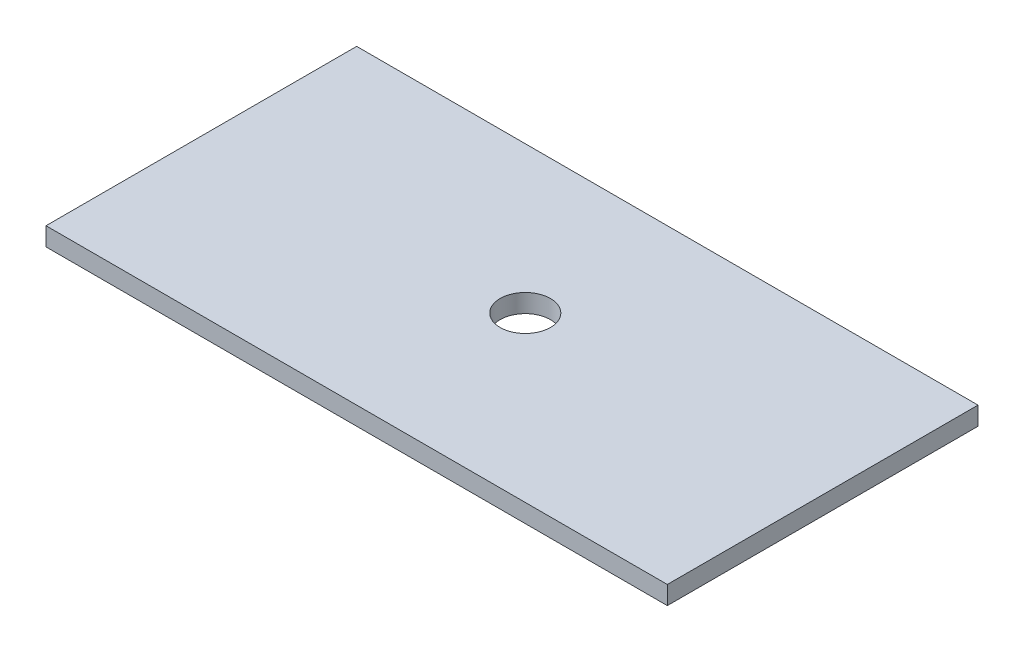
ISO-10303-21;
HEADER;
FILE_DESCRIPTION(('STEP AP214'),'2;1');
FILE_NAME('part.step','',(''),(''),'','','');
FILE_SCHEMA(('AUTOMOTIVE_DESIGN { 1 0 10303 214 1 1 1 1 }'));
ENDSEC;
DATA;
#1=APPLICATION_CONTEXT('core data for automotive mechanical design processes');
#2=APPLICATION_PROTOCOL_DEFINITION('international standard','automotive_design',2000,#1);
#3=PRODUCT_CONTEXT('',#1,'mechanical');
#4=PRODUCT('Part','Part','',(#3));
#5=PRODUCT_RELATED_PRODUCT_CATEGORY('part','',(#4));
#6=PRODUCT_DEFINITION_FORMATION('','',#4);
#7=PRODUCT_DEFINITION_CONTEXT('part definition',#1,'design');
#8=PRODUCT_DEFINITION('design','',#6,#7);
#9=PRODUCT_DEFINITION_SHAPE('','',#8);
#10=(LENGTH_UNIT() NAMED_UNIT(*) SI_UNIT(.MILLI.,.METRE.));
#11=(NAMED_UNIT(*) PLANE_ANGLE_UNIT() SI_UNIT($,.RADIAN.));
#12=(NAMED_UNIT(*) SI_UNIT($,.STERADIAN.) SOLID_ANGLE_UNIT());
#13=UNCERTAINTY_MEASURE_WITH_UNIT(LENGTH_MEASURE(1.E-05),#10,'distance_accuracy_value','');
#14=(GEOMETRIC_REPRESENTATION_CONTEXT(3) GLOBAL_UNCERTAINTY_ASSIGNED_CONTEXT((#13)) GLOBAL_UNIT_ASSIGNED_CONTEXT((#10,
#11,#12)) REPRESENTATION_CONTEXT('',''));
#15=CARTESIAN_POINT('',(0.,0.,0.));
#16=DIRECTION('',(0.,0.,1.));
#17=DIRECTION('',(1.,0.,0.));
#18=AXIS2_PLACEMENT_3D('',#15,#16,#17);
#19=CARTESIAN_POINT('',(0.,15.,0.));
#20=DIRECTION('',(0.,1.,0.));
#21=DIRECTION('',(0.,0.,1.));
#22=AXIS2_PLACEMENT_3D('',#19,#20,#21);
#23=PLANE('',#22);
#24=DIRECTION('',(0.,0.,1.));
#25=VECTOR('',#24,1.);
#26=CARTESIAN_POINT('',(0.,15.,0.));
#27=LINE('',#26,#25);
#28=CARTESIAN_POINT('',(0.,15.,0.));
#29=VERTEX_POINT('',#28);
#30=CARTESIAN_POINT('',(0.,15.,254.));
#31=VERTEX_POINT('',#30);
#32=EDGE_CURVE('E85',#29,#31,#27,.T.);
#33=ORIENTED_EDGE('',*,*,#32,.T.);
#34=DIRECTION('',(1.,0.,0.));
#35=VECTOR('',#34,1.);
#36=CARTESIAN_POINT('',(0.,15.,254.));
#37=LINE('',#36,#35);
#38=CARTESIAN_POINT('',(508.,15.,254.));
#39=VERTEX_POINT('',#38);
#40=EDGE_CURVE('E80',#31,#39,#37,.T.);
#41=ORIENTED_EDGE('',*,*,#40,.T.);
#42=DIRECTION('',(0.,0.,-1.));
#43=VECTOR('',#42,1.);
#44=CARTESIAN_POINT('',(508.,15.,0.));
#45=LINE('',#44,#43);
#46=CARTESIAN_POINT('',(508.,15.,0.));
#47=VERTEX_POINT('',#46);
#48=EDGE_CURVE('E83',#39,#47,#45,.T.);
#49=ORIENTED_EDGE('',*,*,#48,.T.);
#50=DIRECTION('',(-1.,0.,0.));
#51=VECTOR('',#50,1.);
#52=CARTESIAN_POINT('',(0.,15.,0.));
#53=LINE('',#52,#51);
#54=EDGE_CURVE('E50',#47,#29,#53,.T.);
#55=ORIENTED_EDGE('',*,*,#54,.T.);
#56=EDGE_LOOP('',(#33,#41,#49,#55));
#57=FACE_BOUND('',#56,.T.);
#58=CARTESIAN_POINT('',(257.707741617895,15.,119.849355451203));
#59=DIRECTION('',(0.,1.,0.));
#60=DIRECTION('',(0.,0.,1.));
#61=AXIS2_PLACEMENT_3D('',#58,#59,#60);
#62=CIRCLE('',#61,20.5570102159983);
#63=CARTESIAN_POINT('',(257.707741617895,15.,140.406365667201));
#64=VERTEX_POINT('',#63);
#65=EDGE_CURVE('E100',#64,#64,#62,.T.);
#66=ORIENTED_EDGE('',*,*,#65,.F.);
#67=EDGE_LOOP('',(#66));
#68=FACE_BOUND('',#67,.T.);
#69=ADVANCED_FACE('F33',(#57,#68),#23,.T.);
#70=CARTESIAN_POINT('',(0.,0.,0.));
#71=DIRECTION('',(0.,1.,0.));
#72=DIRECTION('',(0.,0.,1.));
#73=AXIS2_PLACEMENT_3D('',#70,#71,#72);
#74=PLANE('',#73);
#75=DIRECTION('',(0.,0.,1.));
#76=VECTOR('',#75,1.);
#77=CARTESIAN_POINT('',(0.,0.,0.));
#78=LINE('',#77,#76);
#79=CARTESIAN_POINT('',(0.,0.,0.));
#80=VERTEX_POINT('',#79);
#81=CARTESIAN_POINT('',(0.,0.,254.));
#82=VERTEX_POINT('',#81);
#83=EDGE_CURVE('E97',#80,#82,#78,.T.);
#84=ORIENTED_EDGE('',*,*,#83,.F.);
#85=DIRECTION('',(-1.,0.,0.));
#86=VECTOR('',#85,1.);
#87=CARTESIAN_POINT('',(0.,0.,0.));
#88=LINE('',#87,#86);
#89=CARTESIAN_POINT('',(508.,0.,0.));
#90=VERTEX_POINT('',#89);
#91=EDGE_CURVE('E73',#90,#80,#88,.T.);
#92=ORIENTED_EDGE('',*,*,#91,.F.);
#93=DIRECTION('',(0.,0.,-1.));
#94=VECTOR('',#93,1.);
#95=CARTESIAN_POINT('',(508.,0.,0.));
#96=LINE('',#95,#94);
#97=CARTESIAN_POINT('',(508.,0.,254.));
#98=VERTEX_POINT('',#97);
#99=EDGE_CURVE('E67',#98,#90,#96,.T.);
#100=ORIENTED_EDGE('',*,*,#99,.F.);
#101=DIRECTION('',(1.,0.,0.));
#102=VECTOR('',#101,1.);
#103=CARTESIAN_POINT('',(0.,0.,254.));
#104=LINE('',#103,#102);
#105=EDGE_CURVE('E89',#82,#98,#104,.T.);
#106=ORIENTED_EDGE('',*,*,#105,.F.);
#107=EDGE_LOOP('',(#84,#92,#100,#106));
#108=FACE_BOUND('',#107,.T.);
#109=CARTESIAN_POINT('',(257.707741617895,0.,119.849355451203));
#110=DIRECTION('',(0.,1.,0.));
#111=DIRECTION('',(0.,0.,1.));
#112=AXIS2_PLACEMENT_3D('',#109,#110,#111);
#113=CIRCLE('',#112,20.5570102159983);
#114=CARTESIAN_POINT('',(257.707741617895,0.,140.406365667201));
#115=VERTEX_POINT('',#114);
#116=EDGE_CURVE('E112',#115,#115,#113,.T.);
#117=ORIENTED_EDGE('',*,*,#116,.T.);
#118=EDGE_LOOP('',(#117));
#119=FACE_BOUND('',#118,.T.);
#120=ADVANCED_FACE('F108',(#108,#119),#74,.F.);
#121=CARTESIAN_POINT('',(0.,15.,0.));
#122=DIRECTION('',(1.,0.,0.));
#123=DIRECTION('',(0.,0.,-1.));
#124=AXIS2_PLACEMENT_3D('',#121,#122,#123);
#125=PLANE('',#124);
#126=ORIENTED_EDGE('',*,*,#83,.T.);
#127=DIRECTION('',(0.,-1.,0.));
#128=VECTOR('',#127,1.);
#129=CARTESIAN_POINT('',(0.,15.,254.));
#130=LINE('',#129,#128);
#131=EDGE_CURVE('E11',#31,#82,#130,.T.);
#132=ORIENTED_EDGE('',*,*,#131,.F.);
#133=ORIENTED_EDGE('',*,*,#32,.F.);
#134=DIRECTION('',(0.,-1.,0.));
#135=VECTOR('',#134,1.);
#136=CARTESIAN_POINT('',(0.,15.,0.));
#137=LINE('',#136,#135);
#138=EDGE_CURVE('E93',#29,#80,#137,.T.);
#139=ORIENTED_EDGE('',*,*,#138,.T.);
#140=EDGE_LOOP('',(#126,#132,#133,#139));
#141=FACE_BOUND('',#140,.T.);
#142=ADVANCED_FACE('F35',(#141),#125,.F.);
#143=CARTESIAN_POINT('',(0.,15.,254.));
#144=DIRECTION('',(0.,0.,-1.));
#145=DIRECTION('',(-1.,0.,0.));
#146=AXIS2_PLACEMENT_3D('',#143,#144,#145);
#147=PLANE('',#146);
#148=ORIENTED_EDGE('',*,*,#105,.T.);
#149=DIRECTION('',(0.,-1.,0.));
#150=VECTOR('',#149,1.);
#151=CARTESIAN_POINT('',(508.,15.,254.));
#152=LINE('',#151,#150);
#153=EDGE_CURVE('E42',#39,#98,#152,.T.);
#154=ORIENTED_EDGE('',*,*,#153,.F.);
#155=ORIENTED_EDGE('',*,*,#40,.F.);
#156=ORIENTED_EDGE('',*,*,#131,.T.);
#157=EDGE_LOOP('',(#148,#154,#155,#156));
#158=FACE_BOUND('',#157,.T.);
#159=ADVANCED_FACE('F88',(#158),#147,.F.);
#160=CARTESIAN_POINT('',(508.,15.,0.));
#161=DIRECTION('',(-1.,0.,0.));
#162=DIRECTION('',(0.,0.,1.));
#163=AXIS2_PLACEMENT_3D('',#160,#161,#162);
#164=PLANE('',#163);
#165=ORIENTED_EDGE('',*,*,#99,.T.);
#166=DIRECTION('',(0.,-1.,0.));
#167=VECTOR('',#166,1.);
#168=CARTESIAN_POINT('',(508.,15.,0.));
#169=LINE('',#168,#167);
#170=EDGE_CURVE('E90',#47,#90,#169,.T.);
#171=ORIENTED_EDGE('',*,*,#170,.F.);
#172=ORIENTED_EDGE('',*,*,#48,.F.);
#173=ORIENTED_EDGE('',*,*,#153,.T.);
#174=EDGE_LOOP('',(#165,#171,#172,#173));
#175=FACE_BOUND('',#174,.T.);
#176=ADVANCED_FACE('F91',(#175),#164,.F.);
#177=CARTESIAN_POINT('',(0.,15.,0.));
#178=DIRECTION('',(0.,0.,1.));
#179=DIRECTION('',(1.,0.,0.));
#180=AXIS2_PLACEMENT_3D('',#177,#178,#179);
#181=PLANE('',#180);
#182=ORIENTED_EDGE('',*,*,#91,.T.);
#183=ORIENTED_EDGE('',*,*,#138,.F.);
#184=ORIENTED_EDGE('',*,*,#54,.F.);
#185=ORIENTED_EDGE('',*,*,#170,.T.);
#186=EDGE_LOOP('',(#182,#183,#184,#185));
#187=FACE_BOUND('',#186,.T.);
#188=ADVANCED_FACE('F105',(#187),#181,.F.);
#189=CARTESIAN_POINT('',(257.707741617895,15.,119.849355451203));
#190=DIRECTION('',(0.,-1.,0.));
#191=DIRECTION('',(0.,0.,-1.));
#192=AXIS2_PLACEMENT_3D('',#189,#190,#191);
#193=CYLINDRICAL_SURFACE('',#192,20.5570102159983);
#194=ORIENTED_EDGE('',*,*,#65,.T.);
#195=EDGE_LOOP('',(#194));
#196=FACE_BOUND('',#195,.T.);
#197=ORIENTED_EDGE('',*,*,#116,.F.);
#198=EDGE_LOOP('',(#197));
#199=FACE_BOUND('',#198,.T.);
#200=ADVANCED_FACE('F118',(#196,#199),#193,.F.);
#201=CLOSED_SHELL('',(#69,#120,#142,#159,#176,#188,#200));
#202=MANIFOLD_SOLID_BREP('B2',#201);
#203=ADVANCED_BREP_SHAPE_REPRESENTATION('',(#18,#202),#14);
#204=SHAPE_DEFINITION_REPRESENTATION(#9,#203);
ENDSEC;
END-ISO-10303-21;
